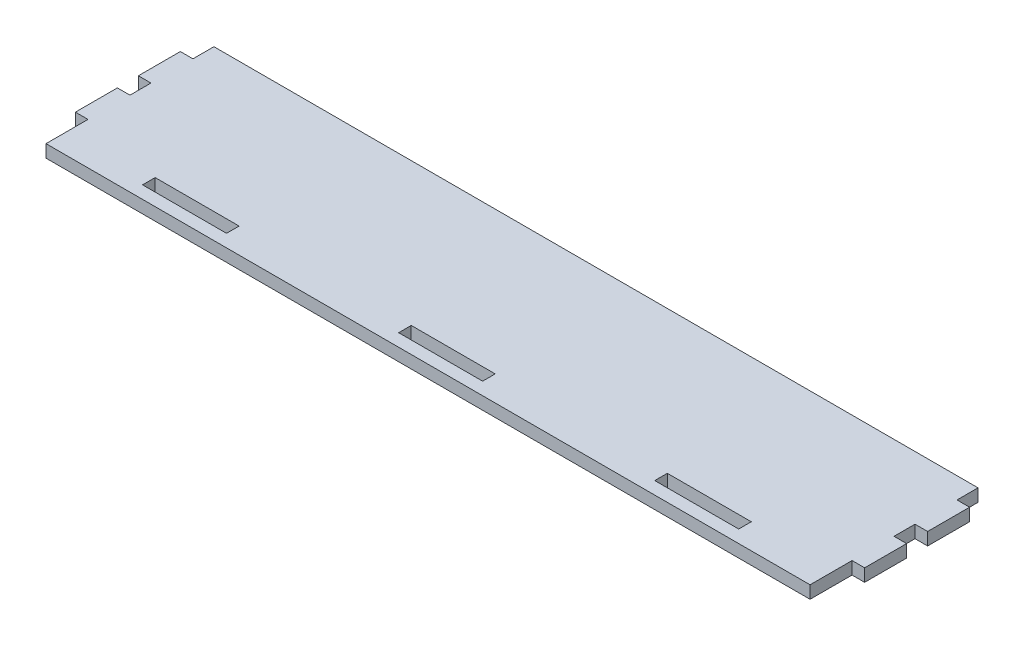
ISO-10303-21;
HEADER;
FILE_DESCRIPTION(('STEP AP214'),'2;1');
FILE_NAME('part.step','',(''),(''),'','','');
FILE_SCHEMA(('AUTOMOTIVE_DESIGN { 1 0 10303 214 1 1 1 1 }'));
ENDSEC;
DATA;
#1=APPLICATION_CONTEXT('core data for automotive mechanical design processes');
#2=APPLICATION_PROTOCOL_DEFINITION('international standard','automotive_design',2000,#1);
#3=PRODUCT_CONTEXT('',#1,'mechanical');
#4=PRODUCT('Part','Part','',(#3));
#5=PRODUCT_RELATED_PRODUCT_CATEGORY('part','',(#4));
#6=PRODUCT_DEFINITION_FORMATION('','',#4);
#7=PRODUCT_DEFINITION_CONTEXT('part definition',#1,'design');
#8=PRODUCT_DEFINITION('design','',#6,#7);
#9=PRODUCT_DEFINITION_SHAPE('','',#8);
#10=(LENGTH_UNIT() NAMED_UNIT(*) SI_UNIT(.MILLI.,.METRE.));
#11=(NAMED_UNIT(*) PLANE_ANGLE_UNIT() SI_UNIT($,.RADIAN.));
#12=(NAMED_UNIT(*) SI_UNIT($,.STERADIAN.) SOLID_ANGLE_UNIT());
#13=UNCERTAINTY_MEASURE_WITH_UNIT(LENGTH_MEASURE(1.E-05),#10,'distance_accuracy_value','');
#14=(GEOMETRIC_REPRESENTATION_CONTEXT(3) GLOBAL_UNCERTAINTY_ASSIGNED_CONTEXT((#13)) GLOBAL_UNIT_ASSIGNED_CONTEXT((#10,
#11,#12)) REPRESENTATION_CONTEXT('',''));
#15=CARTESIAN_POINT('',(0.,0.,0.));
#16=DIRECTION('',(0.,0.,1.));
#17=DIRECTION('',(1.,0.,0.));
#18=AXIS2_PLACEMENT_3D('',#15,#16,#17);
#19=CARTESIAN_POINT('',(0.,3.,0.));
#20=DIRECTION('',(0.,1.,0.));
#21=DIRECTION('',(0.,0.,1.));
#22=AXIS2_PLACEMENT_3D('',#19,#20,#21);
#23=PLANE('',#22);
#24=DIRECTION('',(0.,0.,1.));
#25=VECTOR('',#24,1.);
#26=CARTESIAN_POINT('',(0.,3.,0.));
#27=LINE('',#26,#25);
#28=CARTESIAN_POINT('',(0.,3.,-10.));
#29=VERTEX_POINT('',#28);
#30=CARTESIAN_POINT('',(0.,3.,0.));
#31=VERTEX_POINT('',#30);
#32=EDGE_CURVE('E340',#29,#31,#27,.T.);
#33=ORIENTED_EDGE('',*,*,#32,.T.);
#34=DIRECTION('',(1.,0.,0.));
#35=VECTOR('',#34,1.);
#36=CARTESIAN_POINT('',(0.,3.,0.));
#37=LINE('',#36,#35);
#38=CARTESIAN_POINT('',(182.,3.,0.));
#39=VERTEX_POINT('',#38);
#40=EDGE_CURVE('E343',#31,#39,#37,.T.);
#41=ORIENTED_EDGE('',*,*,#40,.T.);
#42=DIRECTION('',(0.,0.,-1.));
#43=VECTOR('',#42,1.);
#44=CARTESIAN_POINT('',(182.,3.,0.));
#45=LINE('',#44,#43);
#46=CARTESIAN_POINT('',(182.,3.,-9.99999999999999));
#47=VERTEX_POINT('',#46);
#48=EDGE_CURVE('E346',#39,#47,#45,.T.);
#49=ORIENTED_EDGE('',*,*,#48,.T.);
#50=DIRECTION('',(1.,0.,0.));
#51=VECTOR('',#50,1.);
#52=CARTESIAN_POINT('',(182.,3.,-9.99999999999999));
#53=LINE('',#52,#51);
#54=CARTESIAN_POINT('',(185.,3.,-9.99999999999999));
#55=VERTEX_POINT('',#54);
#56=EDGE_CURVE('E348',#47,#55,#53,.T.);
#57=ORIENTED_EDGE('',*,*,#56,.T.);
#58=DIRECTION('',(0.,0.,-1.));
#59=VECTOR('',#58,1.);
#60=CARTESIAN_POINT('',(185.,3.,-20.));
#61=LINE('',#60,#59);
#62=CARTESIAN_POINT('',(185.,3.,-20.));
#63=VERTEX_POINT('',#62);
#64=EDGE_CURVE('E350',#55,#63,#61,.T.);
#65=ORIENTED_EDGE('',*,*,#64,.T.);
#66=DIRECTION('',(-1.,0.,0.));
#67=VECTOR('',#66,1.);
#68=CARTESIAN_POINT('',(182.,3.,-20.));
#69=LINE('',#68,#67);
#70=CARTESIAN_POINT('',(182.,3.,-20.));
#71=VERTEX_POINT('',#70);
#72=EDGE_CURVE('E352',#63,#71,#69,.T.);
#73=ORIENTED_EDGE('',*,*,#72,.T.);
#74=DIRECTION('',(0.,0.,-1.));
#75=VECTOR('',#74,1.);
#76=CARTESIAN_POINT('',(182.,3.,-20.));
#77=LINE('',#76,#75);
#78=CARTESIAN_POINT('',(182.,3.,-25.));
#79=VERTEX_POINT('',#78);
#80=EDGE_CURVE('E354',#71,#79,#77,.T.);
#81=ORIENTED_EDGE('',*,*,#80,.T.);
#82=DIRECTION('',(1.,0.,0.));
#83=VECTOR('',#82,1.);
#84=CARTESIAN_POINT('',(182.,3.,-25.));
#85=LINE('',#84,#83);
#86=CARTESIAN_POINT('',(185.,3.,-25.));
#87=VERTEX_POINT('',#86);
#88=EDGE_CURVE('E356',#79,#87,#85,.T.);
#89=ORIENTED_EDGE('',*,*,#88,.T.);
#90=DIRECTION('',(0.,0.,-1.));
#91=VECTOR('',#90,1.);
#92=CARTESIAN_POINT('',(185.,3.,-35.));
#93=LINE('',#92,#91);
#94=CARTESIAN_POINT('',(185.,3.,-35.));
#95=VERTEX_POINT('',#94);
#96=EDGE_CURVE('E358',#87,#95,#93,.T.);
#97=ORIENTED_EDGE('',*,*,#96,.T.);
#98=DIRECTION('',(-1.,0.,0.));
#99=VECTOR('',#98,1.);
#100=CARTESIAN_POINT('',(182.,3.,-35.));
#101=LINE('',#100,#99);
#102=CARTESIAN_POINT('',(182.,3.,-35.));
#103=VERTEX_POINT('',#102);
#104=EDGE_CURVE('E360',#95,#103,#101,.T.);
#105=ORIENTED_EDGE('',*,*,#104,.T.);
#106=DIRECTION('',(0.,0.,-1.));
#107=VECTOR('',#106,1.);
#108=CARTESIAN_POINT('',(182.,3.,-35.));
#109=LINE('',#108,#107);
#110=CARTESIAN_POINT('',(182.,3.,-40.));
#111=VERTEX_POINT('',#110);
#112=EDGE_CURVE('E362',#103,#111,#109,.T.);
#113=ORIENTED_EDGE('',*,*,#112,.T.);
#114=DIRECTION('',(-1.,0.,0.));
#115=VECTOR('',#114,1.);
#116=CARTESIAN_POINT('',(0.,3.,-40.));
#117=LINE('',#116,#115);
#118=CARTESIAN_POINT('',(0.,3.,-40.));
#119=VERTEX_POINT('',#118);
#120=EDGE_CURVE('E364',#111,#119,#117,.T.);
#121=ORIENTED_EDGE('',*,*,#120,.T.);
#122=DIRECTION('',(0.,0.,1.));
#123=VECTOR('',#122,1.);
#124=CARTESIAN_POINT('',(0.,3.,-35.));
#125=LINE('',#124,#123);
#126=CARTESIAN_POINT('',(0.,3.,-35.));
#127=VERTEX_POINT('',#126);
#128=EDGE_CURVE('E366',#119,#127,#125,.T.);
#129=ORIENTED_EDGE('',*,*,#128,.T.);
#130=DIRECTION('',(-1.,0.,0.));
#131=VECTOR('',#130,1.);
#132=CARTESIAN_POINT('',(0.,3.,-35.));
#133=LINE('',#132,#131);
#134=CARTESIAN_POINT('',(-2.99999999999998,3.,-35.));
#135=VERTEX_POINT('',#134);
#136=EDGE_CURVE('E368',#127,#135,#133,.T.);
#137=ORIENTED_EDGE('',*,*,#136,.T.);
#138=DIRECTION('',(0.,0.,1.));
#139=VECTOR('',#138,1.);
#140=CARTESIAN_POINT('',(-2.99999999999998,3.,-35.));
#141=LINE('',#140,#139);
#142=CARTESIAN_POINT('',(-2.99999999999998,3.,-25.));
#143=VERTEX_POINT('',#142);
#144=EDGE_CURVE('E370',#135,#143,#141,.T.);
#145=ORIENTED_EDGE('',*,*,#144,.T.);
#146=DIRECTION('',(1.,0.,0.));
#147=VECTOR('',#146,1.);
#148=CARTESIAN_POINT('',(0.,3.,-25.));
#149=LINE('',#148,#147);
#150=CARTESIAN_POINT('',(0.,3.,-25.));
#151=VERTEX_POINT('',#150);
#152=EDGE_CURVE('E372',#143,#151,#149,.T.);
#153=ORIENTED_EDGE('',*,*,#152,.T.);
#154=DIRECTION('',(0.,0.,1.));
#155=VECTOR('',#154,1.);
#156=CARTESIAN_POINT('',(0.,3.,-20.));
#157=LINE('',#156,#155);
#158=CARTESIAN_POINT('',(0.,3.,-20.));
#159=VERTEX_POINT('',#158);
#160=EDGE_CURVE('E374',#151,#159,#157,.T.);
#161=ORIENTED_EDGE('',*,*,#160,.T.);
#162=DIRECTION('',(-1.,0.,0.));
#163=VECTOR('',#162,1.);
#164=CARTESIAN_POINT('',(0.,3.,-20.));
#165=LINE('',#164,#163);
#166=CARTESIAN_POINT('',(-3.,3.,-20.));
#167=VERTEX_POINT('',#166);
#168=EDGE_CURVE('E376',#159,#167,#165,.T.);
#169=ORIENTED_EDGE('',*,*,#168,.T.);
#170=DIRECTION('',(0.,0.,1.));
#171=VECTOR('',#170,1.);
#172=CARTESIAN_POINT('',(-3.,3.,-20.));
#173=LINE('',#172,#171);
#174=CARTESIAN_POINT('',(-3.,3.,-10.));
#175=VERTEX_POINT('',#174);
#176=EDGE_CURVE('E378',#167,#175,#173,.T.);
#177=ORIENTED_EDGE('',*,*,#176,.T.);
#178=DIRECTION('',(1.,0.,0.));
#179=VECTOR('',#178,1.);
#180=CARTESIAN_POINT('',(0.,3.,-10.));
#181=LINE('',#180,#179);
#182=EDGE_CURVE('E380',#175,#29,#181,.T.);
#183=ORIENTED_EDGE('',*,*,#182,.T.);
#184=EDGE_LOOP('',(#33,#41,#49,#57,#65,#73,#81,#89,#97,#105,#113,#121,#129,#137,#145,#153,#161,
#169,#177,#183));
#185=FACE_BOUND('',#184,.T.);
#186=DIRECTION('',(1.,0.,0.));
#187=VECTOR('',#186,1.);
#188=CARTESIAN_POINT('',(20.,3.,-3.));
#189=LINE('',#188,#187);
#190=CARTESIAN_POINT('',(20.,3.,-3.));
#191=VERTEX_POINT('',#190);
#192=CARTESIAN_POINT('',(40.,3.,-3.00000000000001));
#193=VERTEX_POINT('',#192);
#194=EDGE_CURVE('E311',#191,#193,#189,.T.);
#195=ORIENTED_EDGE('',*,*,#194,.F.);
#196=DIRECTION('',(0.,0.,1.));
#197=VECTOR('',#196,1.);
#198=CARTESIAN_POINT('',(20.,3.,-6.));
#199=LINE('',#198,#197);
#200=CARTESIAN_POINT('',(20.,3.,-6.));
#201=VERTEX_POINT('',#200);
#202=EDGE_CURVE('E309',#201,#191,#199,.T.);
#203=ORIENTED_EDGE('',*,*,#202,.F.);
#204=DIRECTION('',(-1.,0.,0.));
#205=VECTOR('',#204,1.);
#206=CARTESIAN_POINT('',(20.,3.,-6.));
#207=LINE('',#206,#205);
#208=CARTESIAN_POINT('',(40.,3.,-6.00000000000001));
#209=VERTEX_POINT('',#208);
#210=EDGE_CURVE('E317',#209,#201,#207,.T.);
#211=ORIENTED_EDGE('',*,*,#210,.F.);
#212=DIRECTION('',(0.,0.,-1.));
#213=VECTOR('',#212,1.);
#214=CARTESIAN_POINT('',(40.,3.,-6.00000000000001));
#215=LINE('',#214,#213);
#216=EDGE_CURVE('E314',#193,#209,#215,.T.);
#217=ORIENTED_EDGE('',*,*,#216,.F.);
#218=EDGE_LOOP('',(#195,#203,#211,#217));
#219=FACE_BOUND('',#218,.T.);
#220=DIRECTION('',(1.,0.,0.));
#221=VECTOR('',#220,1.);
#222=CARTESIAN_POINT('',(142.,3.,-3.));
#223=LINE('',#222,#221);
#224=CARTESIAN_POINT('',(142.,3.,-3.));
#225=VERTEX_POINT('',#224);
#226=CARTESIAN_POINT('',(162.,3.,-3.));
#227=VERTEX_POINT('',#226);
#228=EDGE_CURVE('E280',#225,#227,#223,.T.);
#229=ORIENTED_EDGE('',*,*,#228,.F.);
#230=DIRECTION('',(0.,0.,1.));
#231=VECTOR('',#230,1.);
#232=CARTESIAN_POINT('',(142.,3.,-6.));
#233=LINE('',#232,#231);
#234=CARTESIAN_POINT('',(142.,3.,-6.));
#235=VERTEX_POINT('',#234);
#236=EDGE_CURVE('E278',#235,#225,#233,.T.);
#237=ORIENTED_EDGE('',*,*,#236,.F.);
#238=DIRECTION('',(-1.,0.,0.));
#239=VECTOR('',#238,1.);
#240=CARTESIAN_POINT('',(142.,3.,-6.));
#241=LINE('',#240,#239);
#242=CARTESIAN_POINT('',(162.,3.,-6.));
#243=VERTEX_POINT('',#242);
#244=EDGE_CURVE('E286',#243,#235,#241,.T.);
#245=ORIENTED_EDGE('',*,*,#244,.F.);
#246=DIRECTION('',(0.,0.,-1.));
#247=VECTOR('',#246,1.);
#248=CARTESIAN_POINT('',(162.,3.,-6.));
#249=LINE('',#248,#247);
#250=EDGE_CURVE('E283',#227,#243,#249,.T.);
#251=ORIENTED_EDGE('',*,*,#250,.F.);
#252=EDGE_LOOP('',(#229,#237,#245,#251));
#253=FACE_BOUND('',#252,.T.);
#254=DIRECTION('',(1.,0.,0.));
#255=VECTOR('',#254,1.);
#256=CARTESIAN_POINT('',(81.,3.,-3.));
#257=LINE('',#256,#255);
#258=CARTESIAN_POINT('',(81.,3.,-3.));
#259=VERTEX_POINT('',#258);
#260=CARTESIAN_POINT('',(101.,3.,-3.));
#261=VERTEX_POINT('',#260);
#262=EDGE_CURVE('E250',#259,#261,#257,.T.);
#263=ORIENTED_EDGE('',*,*,#262,.F.);
#264=DIRECTION('',(0.,0.,1.));
#265=VECTOR('',#264,1.);
#266=CARTESIAN_POINT('',(81.,3.,-6.));
#267=LINE('',#266,#265);
#268=CARTESIAN_POINT('',(81.,3.,-6.));
#269=VERTEX_POINT('',#268);
#270=EDGE_CURVE('E242',#269,#259,#267,.T.);
#271=ORIENTED_EDGE('',*,*,#270,.F.);
#272=DIRECTION('',(-1.,0.,0.));
#273=VECTOR('',#272,1.);
#274=CARTESIAN_POINT('',(81.,3.,-6.));
#275=LINE('',#274,#273);
#276=CARTESIAN_POINT('',(101.,3.,-6.));
#277=VERTEX_POINT('',#276);
#278=EDGE_CURVE('E264',#277,#269,#275,.T.);
#279=ORIENTED_EDGE('',*,*,#278,.F.);
#280=DIRECTION('',(0.,0.,-1.));
#281=VECTOR('',#280,1.);
#282=CARTESIAN_POINT('',(101.,3.,-6.));
#283=LINE('',#282,#281);
#284=EDGE_CURVE('E262',#261,#277,#283,.T.);
#285=ORIENTED_EDGE('',*,*,#284,.F.);
#286=EDGE_LOOP('',(#263,#271,#279,#285));
#287=FACE_BOUND('',#286,.T.);
#288=ADVANCED_FACE('F33',(#185,#219,#253,#287),#23,.T.);
#289=CARTESIAN_POINT('',(0.,0.,0.));
#290=DIRECTION('',(0.,1.,0.));
#291=DIRECTION('',(0.,0.,1.));
#292=AXIS2_PLACEMENT_3D('',#289,#290,#291);
#293=PLANE('',#292);
#294=DIRECTION('',(0.,0.,1.));
#295=VECTOR('',#294,1.);
#296=CARTESIAN_POINT('',(142.,0.,-6.));
#297=LINE('',#296,#295);
#298=CARTESIAN_POINT('',(142.,0.,-6.));
#299=VERTEX_POINT('',#298);
#300=CARTESIAN_POINT('',(142.,0.,-3.));
#301=VERTEX_POINT('',#300);
#302=EDGE_CURVE('E258',#299,#301,#297,.T.);
#303=ORIENTED_EDGE('',*,*,#302,.T.);
#304=DIRECTION('',(1.,0.,0.));
#305=VECTOR('',#304,1.);
#306=CARTESIAN_POINT('',(142.,0.,-3.));
#307=LINE('',#306,#305);
#308=CARTESIAN_POINT('',(162.,0.,-3.));
#309=VERTEX_POINT('',#308);
#310=EDGE_CURVE('E291',#301,#309,#307,.T.);
#311=ORIENTED_EDGE('',*,*,#310,.T.);
#312=DIRECTION('',(0.,0.,-1.));
#313=VECTOR('',#312,1.);
#314=CARTESIAN_POINT('',(162.,0.,-6.));
#315=LINE('',#314,#313);
#316=CARTESIAN_POINT('',(162.,0.,-6.));
#317=VERTEX_POINT('',#316);
#318=EDGE_CURVE('E294',#309,#317,#315,.T.);
#319=ORIENTED_EDGE('',*,*,#318,.T.);
#320=DIRECTION('',(-1.,0.,0.));
#321=VECTOR('',#320,1.);
#322=CARTESIAN_POINT('',(142.,0.,-6.));
#323=LINE('',#322,#321);
#324=EDGE_CURVE('E281',#317,#299,#323,.T.);
#325=ORIENTED_EDGE('',*,*,#324,.T.);
#326=EDGE_LOOP('',(#303,#311,#319,#325));
#327=FACE_BOUND('',#326,.T.);
#328=DIRECTION('',(0.,0.,1.));
#329=VECTOR('',#328,1.);
#330=CARTESIAN_POINT('',(0.,0.,0.));
#331=LINE('',#330,#329);
#332=CARTESIAN_POINT('',(0.,0.,-10.));
#333=VERTEX_POINT('',#332);
#334=CARTESIAN_POINT('',(0.,0.,0.));
#335=VERTEX_POINT('',#334);
#336=EDGE_CURVE('E339',#333,#335,#331,.T.);
#337=ORIENTED_EDGE('',*,*,#336,.F.);
#338=DIRECTION('',(1.,0.,0.));
#339=VECTOR('',#338,1.);
#340=CARTESIAN_POINT('',(0.,0.,-10.));
#341=LINE('',#340,#339);
#342=CARTESIAN_POINT('',(-3.,0.,-10.));
#343=VERTEX_POINT('',#342);
#344=EDGE_CURVE('E344',#343,#333,#341,.T.);
#345=ORIENTED_EDGE('',*,*,#344,.F.);
#346=DIRECTION('',(0.,0.,1.));
#347=VECTOR('',#346,1.);
#348=CARTESIAN_POINT('',(-3.,0.,-20.));
#349=LINE('',#348,#347);
#350=CARTESIAN_POINT('',(-3.,0.,-20.));
#351=VERTEX_POINT('',#350);
#352=EDGE_CURVE('E419',#351,#343,#349,.T.);
#353=ORIENTED_EDGE('',*,*,#352,.F.);
#354=DIRECTION('',(-1.,0.,0.));
#355=VECTOR('',#354,1.);
#356=CARTESIAN_POINT('',(0.,0.,-20.));
#357=LINE('',#356,#355);
#358=CARTESIAN_POINT('',(0.,0.,-20.));
#359=VERTEX_POINT('',#358);
#360=EDGE_CURVE('E417',#359,#351,#357,.T.);
#361=ORIENTED_EDGE('',*,*,#360,.F.);
#362=DIRECTION('',(0.,0.,1.));
#363=VECTOR('',#362,1.);
#364=CARTESIAN_POINT('',(0.,0.,-20.));
#365=LINE('',#364,#363);
#366=CARTESIAN_POINT('',(0.,0.,-25.));
#367=VERTEX_POINT('',#366);
#368=EDGE_CURVE('E415',#367,#359,#365,.T.);
#369=ORIENTED_EDGE('',*,*,#368,.F.);
#370=DIRECTION('',(1.,0.,0.));
#371=VECTOR('',#370,1.);
#372=CARTESIAN_POINT('',(0.,0.,-25.));
#373=LINE('',#372,#371);
#374=CARTESIAN_POINT('',(-2.99999999999998,0.,-25.));
#375=VERTEX_POINT('',#374);
#376=EDGE_CURVE('E413',#375,#367,#373,.T.);
#377=ORIENTED_EDGE('',*,*,#376,.F.);
#378=DIRECTION('',(0.,0.,1.));
#379=VECTOR('',#378,1.);
#380=CARTESIAN_POINT('',(-2.99999999999998,0.,-35.));
#381=LINE('',#380,#379);
#382=CARTESIAN_POINT('',(-2.99999999999998,0.,-35.));
#383=VERTEX_POINT('',#382);
#384=EDGE_CURVE('E411',#383,#375,#381,.T.);
#385=ORIENTED_EDGE('',*,*,#384,.F.);
#386=DIRECTION('',(-1.,0.,0.));
#387=VECTOR('',#386,1.);
#388=CARTESIAN_POINT('',(0.,0.,-35.));
#389=LINE('',#388,#387);
#390=CARTESIAN_POINT('',(0.,0.,-35.));
#391=VERTEX_POINT('',#390);
#392=EDGE_CURVE('E409',#391,#383,#389,.T.);
#393=ORIENTED_EDGE('',*,*,#392,.F.);
#394=DIRECTION('',(0.,0.,1.));
#395=VECTOR('',#394,1.);
#396=CARTESIAN_POINT('',(0.,0.,-35.));
#397=LINE('',#396,#395);
#398=CARTESIAN_POINT('',(0.,0.,-40.));
#399=VERTEX_POINT('',#398);
#400=EDGE_CURVE('E407',#399,#391,#397,.T.);
#401=ORIENTED_EDGE('',*,*,#400,.F.);
#402=DIRECTION('',(-1.,0.,0.));
#403=VECTOR('',#402,1.);
#404=CARTESIAN_POINT('',(0.,0.,-40.));
#405=LINE('',#404,#403);
#406=CARTESIAN_POINT('',(182.,0.,-40.));
#407=VERTEX_POINT('',#406);
#408=EDGE_CURVE('E405',#407,#399,#405,.T.);
#409=ORIENTED_EDGE('',*,*,#408,.F.);
#410=DIRECTION('',(0.,0.,-1.));
#411=VECTOR('',#410,1.);
#412=CARTESIAN_POINT('',(182.,0.,-35.));
#413=LINE('',#412,#411);
#414=CARTESIAN_POINT('',(182.,0.,-35.));
#415=VERTEX_POINT('',#414);
#416=EDGE_CURVE('E403',#415,#407,#413,.T.);
#417=ORIENTED_EDGE('',*,*,#416,.F.);
#418=DIRECTION('',(-1.,0.,0.));
#419=VECTOR('',#418,1.);
#420=CARTESIAN_POINT('',(182.,0.,-35.));
#421=LINE('',#420,#419);
#422=CARTESIAN_POINT('',(185.,0.,-35.));
#423=VERTEX_POINT('',#422);
#424=EDGE_CURVE('E401',#423,#415,#421,.T.);
#425=ORIENTED_EDGE('',*,*,#424,.F.);
#426=DIRECTION('',(0.,0.,-1.));
#427=VECTOR('',#426,1.);
#428=CARTESIAN_POINT('',(185.,0.,-35.));
#429=LINE('',#428,#427);
#430=CARTESIAN_POINT('',(185.,0.,-25.));
#431=VERTEX_POINT('',#430);
#432=EDGE_CURVE('E399',#431,#423,#429,.T.);
#433=ORIENTED_EDGE('',*,*,#432,.F.);
#434=DIRECTION('',(1.,0.,0.));
#435=VECTOR('',#434,1.);
#436=CARTESIAN_POINT('',(182.,0.,-25.));
#437=LINE('',#436,#435);
#438=CARTESIAN_POINT('',(182.,0.,-25.));
#439=VERTEX_POINT('',#438);
#440=EDGE_CURVE('E397',#439,#431,#437,.T.);
#441=ORIENTED_EDGE('',*,*,#440,.F.);
#442=DIRECTION('',(0.,0.,-1.));
#443=VECTOR('',#442,1.);
#444=CARTESIAN_POINT('',(182.,0.,-20.));
#445=LINE('',#444,#443);
#446=CARTESIAN_POINT('',(182.,0.,-20.));
#447=VERTEX_POINT('',#446);
#448=EDGE_CURVE('E395',#447,#439,#445,.T.);
#449=ORIENTED_EDGE('',*,*,#448,.F.);
#450=DIRECTION('',(-1.,0.,0.));
#451=VECTOR('',#450,1.);
#452=CARTESIAN_POINT('',(182.,0.,-20.));
#453=LINE('',#452,#451);
#454=CARTESIAN_POINT('',(185.,0.,-20.));
#455=VERTEX_POINT('',#454);
#456=EDGE_CURVE('E393',#455,#447,#453,.T.);
#457=ORIENTED_EDGE('',*,*,#456,.F.);
#458=DIRECTION('',(0.,0.,-1.));
#459=VECTOR('',#458,1.);
#460=CARTESIAN_POINT('',(185.,0.,-20.));
#461=LINE('',#460,#459);
#462=CARTESIAN_POINT('',(185.,0.,-9.99999999999999));
#463=VERTEX_POINT('',#462);
#464=EDGE_CURVE('E391',#463,#455,#461,.T.);
#465=ORIENTED_EDGE('',*,*,#464,.F.);
#466=DIRECTION('',(1.,0.,0.));
#467=VECTOR('',#466,1.);
#468=CARTESIAN_POINT('',(182.,0.,-9.99999999999999));
#469=LINE('',#468,#467);
#470=CARTESIAN_POINT('',(182.,0.,-9.99999999999999));
#471=VERTEX_POINT('',#470);
#472=EDGE_CURVE('E389',#471,#463,#469,.T.);
#473=ORIENTED_EDGE('',*,*,#472,.F.);
#474=DIRECTION('',(0.,0.,-1.));
#475=VECTOR('',#474,1.);
#476=CARTESIAN_POINT('',(182.,0.,0.));
#477=LINE('',#476,#475);
#478=CARTESIAN_POINT('',(182.,0.,0.));
#479=VERTEX_POINT('',#478);
#480=EDGE_CURVE('E387',#479,#471,#477,.T.);
#481=ORIENTED_EDGE('',*,*,#480,.F.);
#482=DIRECTION('',(1.,0.,0.));
#483=VECTOR('',#482,1.);
#484=CARTESIAN_POINT('',(0.,0.,0.));
#485=LINE('',#484,#483);
#486=EDGE_CURVE('E385',#335,#479,#485,.T.);
#487=ORIENTED_EDGE('',*,*,#486,.F.);
#488=EDGE_LOOP('',(#337,#345,#353,#361,#369,#377,#385,#393,#401,#409,#417,#425,#433,#441,#449,
#457,#465,#473,#481,#487));
#489=FACE_BOUND('',#488,.T.);
#490=DIRECTION('',(0.,0.,1.));
#491=VECTOR('',#490,1.);
#492=CARTESIAN_POINT('',(20.,0.,-6.));
#493=LINE('',#492,#491);
#494=CARTESIAN_POINT('',(20.,0.,-6.));
#495=VERTEX_POINT('',#494);
#496=CARTESIAN_POINT('',(20.,0.,-3.));
#497=VERTEX_POINT('',#496);
#498=EDGE_CURVE('E308',#495,#497,#493,.T.);
#499=ORIENTED_EDGE('',*,*,#498,.T.);
#500=DIRECTION('',(1.,0.,0.));
#501=VECTOR('',#500,1.);
#502=CARTESIAN_POINT('',(20.,0.,-3.));
#503=LINE('',#502,#501);
#504=CARTESIAN_POINT('',(40.,0.,-3.00000000000001));
#505=VERTEX_POINT('',#504);
#506=EDGE_CURVE('E322',#497,#505,#503,.T.);
#507=ORIENTED_EDGE('',*,*,#506,.T.);
#508=DIRECTION('',(0.,0.,-1.));
#509=VECTOR('',#508,1.);
#510=CARTESIAN_POINT('',(40.,0.,-6.00000000000001));
#511=LINE('',#510,#509);
#512=CARTESIAN_POINT('',(40.,0.,-6.00000000000001));
#513=VERTEX_POINT('',#512);
#514=EDGE_CURVE('E325',#505,#513,#511,.T.);
#515=ORIENTED_EDGE('',*,*,#514,.T.);
#516=DIRECTION('',(-1.,0.,0.));
#517=VECTOR('',#516,1.);
#518=CARTESIAN_POINT('',(20.,0.,-6.));
#519=LINE('',#518,#517);
#520=EDGE_CURVE('E312',#513,#495,#519,.T.);
#521=ORIENTED_EDGE('',*,*,#520,.T.);
#522=EDGE_LOOP('',(#499,#507,#515,#521));
#523=FACE_BOUND('',#522,.T.);
#524=DIRECTION('',(0.,0.,1.));
#525=VECTOR('',#524,1.);
#526=CARTESIAN_POINT('',(81.,0.,-6.));
#527=LINE('',#526,#525);
#528=CARTESIAN_POINT('',(81.,0.,-6.));
#529=VERTEX_POINT('',#528);
#530=CARTESIAN_POINT('',(81.,0.,-3.));
#531=VERTEX_POINT('',#530);
#532=EDGE_CURVE('E56',#529,#531,#527,.T.);
#533=ORIENTED_EDGE('',*,*,#532,.T.);
#534=DIRECTION('',(1.,0.,0.));
#535=VECTOR('',#534,1.);
#536=CARTESIAN_POINT('',(81.,0.,-3.));
#537=LINE('',#536,#535);
#538=CARTESIAN_POINT('',(101.,0.,-3.));
#539=VERTEX_POINT('',#538);
#540=EDGE_CURVE('E257',#531,#539,#537,.T.);
#541=ORIENTED_EDGE('',*,*,#540,.T.);
#542=DIRECTION('',(0.,0.,-1.));
#543=VECTOR('',#542,1.);
#544=CARTESIAN_POINT('',(101.,0.,-6.));
#545=LINE('',#544,#543);
#546=CARTESIAN_POINT('',(101.,0.,-6.));
#547=VERTEX_POINT('',#546);
#548=EDGE_CURVE('E270',#539,#547,#545,.T.);
#549=ORIENTED_EDGE('',*,*,#548,.T.);
#550=DIRECTION('',(-1.,0.,0.));
#551=VECTOR('',#550,1.);
#552=CARTESIAN_POINT('',(81.,0.,-6.));
#553=LINE('',#552,#551);
#554=EDGE_CURVE('E251',#547,#529,#553,.T.);
#555=ORIENTED_EDGE('',*,*,#554,.T.);
#556=EDGE_LOOP('',(#533,#541,#549,#555));
#557=FACE_BOUND('',#556,.T.);
#558=ADVANCED_FACE('F485',(#327,#489,#523,#557),#293,.F.);
#559=CARTESIAN_POINT('',(0.,3.,0.));
#560=DIRECTION('',(1.,0.,0.));
#561=DIRECTION('',(0.,0.,-1.));
#562=AXIS2_PLACEMENT_3D('',#559,#560,#561);
#563=PLANE('',#562);
#564=ORIENTED_EDGE('',*,*,#336,.T.);
#565=DIRECTION('',(0.,-1.,0.));
#566=VECTOR('',#565,1.);
#567=CARTESIAN_POINT('',(0.,3.,0.));
#568=LINE('',#567,#566);
#569=EDGE_CURVE('E11',#31,#335,#568,.T.);
#570=ORIENTED_EDGE('',*,*,#569,.F.);
#571=ORIENTED_EDGE('',*,*,#32,.F.);
#572=DIRECTION('',(0.,-1.,0.));
#573=VECTOR('',#572,1.);
#574=CARTESIAN_POINT('',(0.,3.,-10.));
#575=LINE('',#574,#573);
#576=EDGE_CURVE('E382',#29,#333,#575,.T.);
#577=ORIENTED_EDGE('',*,*,#576,.T.);
#578=EDGE_LOOP('',(#564,#570,#571,#577));
#579=FACE_BOUND('',#578,.T.);
#580=ADVANCED_FACE('F35',(#579),#563,.F.);
#581=CARTESIAN_POINT('',(0.,3.,0.));
#582=DIRECTION('',(0.,0.,-1.));
#583=DIRECTION('',(-1.,0.,0.));
#584=AXIS2_PLACEMENT_3D('',#581,#582,#583);
#585=PLANE('',#584);
#586=ORIENTED_EDGE('',*,*,#486,.T.);
#587=DIRECTION('',(0.,-1.,0.));
#588=VECTOR('',#587,1.);
#589=CARTESIAN_POINT('',(182.,3.,0.));
#590=LINE('',#589,#588);
#591=EDGE_CURVE('E41',#39,#479,#590,.T.);
#592=ORIENTED_EDGE('',*,*,#591,.F.);
#593=ORIENTED_EDGE('',*,*,#40,.F.);
#594=ORIENTED_EDGE('',*,*,#569,.T.);
#595=EDGE_LOOP('',(#586,#592,#593,#594));
#596=FACE_BOUND('',#595,.T.);
#597=ADVANCED_FACE('F503',(#596),#585,.F.);
#598=CARTESIAN_POINT('',(182.,3.,0.));
#599=DIRECTION('',(-1.,0.,0.));
#600=DIRECTION('',(0.,0.,1.));
#601=AXIS2_PLACEMENT_3D('',#598,#599,#600);
#602=PLANE('',#601);
#603=ORIENTED_EDGE('',*,*,#480,.T.);
#604=DIRECTION('',(0.,-1.,0.));
#605=VECTOR('',#604,1.);
#606=CARTESIAN_POINT('',(182.,3.,-9.99999999999999));
#607=LINE('',#606,#605);
#608=EDGE_CURVE('E472',#47,#471,#607,.T.);
#609=ORIENTED_EDGE('',*,*,#608,.F.);
#610=ORIENTED_EDGE('',*,*,#48,.F.);
#611=ORIENTED_EDGE('',*,*,#591,.T.);
#612=EDGE_LOOP('',(#603,#609,#610,#611));
#613=FACE_BOUND('',#612,.T.);
#614=ADVANCED_FACE('F479',(#613),#602,.F.);
#615=CARTESIAN_POINT('',(182.,3.,-9.99999999999999));
#616=DIRECTION('',(0.,0.,-1.));
#617=DIRECTION('',(-1.,0.,0.));
#618=AXIS2_PLACEMENT_3D('',#615,#616,#617);
#619=PLANE('',#618);
#620=ORIENTED_EDGE('',*,*,#472,.T.);
#621=DIRECTION('',(0.,-1.,0.));
#622=VECTOR('',#621,1.);
#623=CARTESIAN_POINT('',(185.,3.,-9.99999999999999));
#624=LINE('',#623,#622);
#625=EDGE_CURVE('E469',#55,#463,#624,.T.);
#626=ORIENTED_EDGE('',*,*,#625,.F.);
#627=ORIENTED_EDGE('',*,*,#56,.F.);
#628=ORIENTED_EDGE('',*,*,#608,.T.);
#629=EDGE_LOOP('',(#620,#626,#627,#628));
#630=FACE_BOUND('',#629,.T.);
#631=ADVANCED_FACE('F491',(#630),#619,.F.);
#632=CARTESIAN_POINT('',(185.,3.,-20.));
#633=DIRECTION('',(-1.,0.,0.));
#634=DIRECTION('',(0.,0.,1.));
#635=AXIS2_PLACEMENT_3D('',#632,#633,#634);
#636=PLANE('',#635);
#637=ORIENTED_EDGE('',*,*,#464,.T.);
#638=DIRECTION('',(0.,-1.,0.));
#639=VECTOR('',#638,1.);
#640=CARTESIAN_POINT('',(185.,3.,-20.));
#641=LINE('',#640,#639);
#642=EDGE_CURVE('E466',#63,#455,#641,.T.);
#643=ORIENTED_EDGE('',*,*,#642,.F.);
#644=ORIENTED_EDGE('',*,*,#64,.F.);
#645=ORIENTED_EDGE('',*,*,#625,.T.);
#646=EDGE_LOOP('',(#637,#643,#644,#645));
#647=FACE_BOUND('',#646,.T.);
#648=ADVANCED_FACE('F495',(#647),#636,.F.);
#649=CARTESIAN_POINT('',(182.,3.,-20.));
#650=DIRECTION('',(0.,0.,1.));
#651=DIRECTION('',(1.,0.,0.));
#652=AXIS2_PLACEMENT_3D('',#649,#650,#651);
#653=PLANE('',#652);
#654=ORIENTED_EDGE('',*,*,#456,.T.);
#655=DIRECTION('',(0.,-1.,0.));
#656=VECTOR('',#655,1.);
#657=CARTESIAN_POINT('',(182.,3.,-20.));
#658=LINE('',#657,#656);
#659=EDGE_CURVE('E463',#71,#447,#658,.T.);
#660=ORIENTED_EDGE('',*,*,#659,.F.);
#661=ORIENTED_EDGE('',*,*,#72,.F.);
#662=ORIENTED_EDGE('',*,*,#642,.T.);
#663=EDGE_LOOP('',(#654,#660,#661,#662));
#664=FACE_BOUND('',#663,.T.);
#665=ADVANCED_FACE('F576',(#664),#653,.F.);
#666=CARTESIAN_POINT('',(182.,3.,-20.));
#667=DIRECTION('',(-1.,0.,0.));
#668=DIRECTION('',(0.,0.,1.));
#669=AXIS2_PLACEMENT_3D('',#666,#667,#668);
#670=PLANE('',#669);
#671=ORIENTED_EDGE('',*,*,#448,.T.);
#672=DIRECTION('',(0.,-1.,0.));
#673=VECTOR('',#672,1.);
#674=CARTESIAN_POINT('',(182.,3.,-25.));
#675=LINE('',#674,#673);
#676=EDGE_CURVE('E460',#79,#439,#675,.T.);
#677=ORIENTED_EDGE('',*,*,#676,.F.);
#678=ORIENTED_EDGE('',*,*,#80,.F.);
#679=ORIENTED_EDGE('',*,*,#659,.T.);
#680=EDGE_LOOP('',(#671,#677,#678,#679));
#681=FACE_BOUND('',#680,.T.);
#682=ADVANCED_FACE('F574',(#681),#670,.F.);
#683=CARTESIAN_POINT('',(182.,3.,-25.));
#684=DIRECTION('',(0.,0.,-1.));
#685=DIRECTION('',(-1.,0.,0.));
#686=AXIS2_PLACEMENT_3D('',#683,#684,#685);
#687=PLANE('',#686);
#688=ORIENTED_EDGE('',*,*,#440,.T.);
#689=DIRECTION('',(0.,-1.,0.));
#690=VECTOR('',#689,1.);
#691=CARTESIAN_POINT('',(185.,3.,-25.));
#692=LINE('',#691,#690);
#693=EDGE_CURVE('E457',#87,#431,#692,.T.);
#694=ORIENTED_EDGE('',*,*,#693,.F.);
#695=ORIENTED_EDGE('',*,*,#88,.F.);
#696=ORIENTED_EDGE('',*,*,#676,.T.);
#697=EDGE_LOOP('',(#688,#694,#695,#696));
#698=FACE_BOUND('',#697,.T.);
#699=ADVANCED_FACE('F569',(#698),#687,.F.);
#700=CARTESIAN_POINT('',(185.,3.,-35.));
#701=DIRECTION('',(-1.,0.,0.));
#702=DIRECTION('',(0.,0.,1.));
#703=AXIS2_PLACEMENT_3D('',#700,#701,#702);
#704=PLANE('',#703);
#705=ORIENTED_EDGE('',*,*,#432,.T.);
#706=DIRECTION('',(0.,-1.,0.));
#707=VECTOR('',#706,1.);
#708=CARTESIAN_POINT('',(185.,3.,-35.));
#709=LINE('',#708,#707);
#710=EDGE_CURVE('E454',#95,#423,#709,.T.);
#711=ORIENTED_EDGE('',*,*,#710,.F.);
#712=ORIENTED_EDGE('',*,*,#96,.F.);
#713=ORIENTED_EDGE('',*,*,#693,.T.);
#714=EDGE_LOOP('',(#705,#711,#712,#713));
#715=FACE_BOUND('',#714,.T.);
#716=ADVANCED_FACE('F564',(#715),#704,.F.);
#717=CARTESIAN_POINT('',(182.,3.,-35.));
#718=DIRECTION('',(0.,0.,1.));
#719=DIRECTION('',(1.,0.,0.));
#720=AXIS2_PLACEMENT_3D('',#717,#718,#719);
#721=PLANE('',#720);
#722=ORIENTED_EDGE('',*,*,#424,.T.);
#723=DIRECTION('',(0.,-1.,0.));
#724=VECTOR('',#723,1.);
#725=CARTESIAN_POINT('',(182.,3.,-35.));
#726=LINE('',#725,#724);
#727=EDGE_CURVE('E451',#103,#415,#726,.T.);
#728=ORIENTED_EDGE('',*,*,#727,.F.);
#729=ORIENTED_EDGE('',*,*,#104,.F.);
#730=ORIENTED_EDGE('',*,*,#710,.T.);
#731=EDGE_LOOP('',(#722,#728,#729,#730));
#732=FACE_BOUND('',#731,.T.);
#733=ADVANCED_FACE('F560',(#732),#721,.F.);
#734=CARTESIAN_POINT('',(182.,3.,-35.));
#735=DIRECTION('',(-1.,0.,0.));
#736=DIRECTION('',(0.,0.,1.));
#737=AXIS2_PLACEMENT_3D('',#734,#735,#736);
#738=PLANE('',#737);
#739=ORIENTED_EDGE('',*,*,#416,.T.);
#740=DIRECTION('',(0.,-1.,0.));
#741=VECTOR('',#740,1.);
#742=CARTESIAN_POINT('',(182.,3.,-40.));
#743=LINE('',#742,#741);
#744=EDGE_CURVE('E448',#111,#407,#743,.T.);
#745=ORIENTED_EDGE('',*,*,#744,.F.);
#746=ORIENTED_EDGE('',*,*,#112,.F.);
#747=ORIENTED_EDGE('',*,*,#727,.T.);
#748=EDGE_LOOP('',(#739,#745,#746,#747));
#749=FACE_BOUND('',#748,.T.);
#750=ADVANCED_FACE('F555',(#749),#738,.F.);
#751=CARTESIAN_POINT('',(0.,3.,-40.));
#752=DIRECTION('',(0.,0.,1.));
#753=DIRECTION('',(1.,0.,0.));
#754=AXIS2_PLACEMENT_3D('',#751,#752,#753);
#755=PLANE('',#754);
#756=ORIENTED_EDGE('',*,*,#408,.T.);
#757=DIRECTION('',(0.,-1.,0.));
#758=VECTOR('',#757,1.);
#759=CARTESIAN_POINT('',(0.,3.,-40.));
#760=LINE('',#759,#758);
#761=EDGE_CURVE('E445',#119,#399,#760,.T.);
#762=ORIENTED_EDGE('',*,*,#761,.F.);
#763=ORIENTED_EDGE('',*,*,#120,.F.);
#764=ORIENTED_EDGE('',*,*,#744,.T.);
#765=EDGE_LOOP('',(#756,#762,#763,#764));
#766=FACE_BOUND('',#765,.T.);
#767=ADVANCED_FACE('F549',(#766),#755,.F.);
#768=CARTESIAN_POINT('',(0.,3.,-35.));
#769=DIRECTION('',(1.,0.,0.));
#770=DIRECTION('',(0.,0.,-1.));
#771=AXIS2_PLACEMENT_3D('',#768,#769,#770);
#772=PLANE('',#771);
#773=ORIENTED_EDGE('',*,*,#400,.T.);
#774=DIRECTION('',(0.,-1.,0.));
#775=VECTOR('',#774,1.);
#776=CARTESIAN_POINT('',(0.,3.,-35.));
#777=LINE('',#776,#775);
#778=EDGE_CURVE('E442',#127,#391,#777,.T.);
#779=ORIENTED_EDGE('',*,*,#778,.F.);
#780=ORIENTED_EDGE('',*,*,#128,.F.);
#781=ORIENTED_EDGE('',*,*,#761,.T.);
#782=EDGE_LOOP('',(#773,#779,#780,#781));
#783=FACE_BOUND('',#782,.T.);
#784=ADVANCED_FACE('F545',(#783),#772,.F.);
#785=CARTESIAN_POINT('',(0.,3.,-35.));
#786=DIRECTION('',(0.,0.,1.));
#787=DIRECTION('',(1.,0.,0.));
#788=AXIS2_PLACEMENT_3D('',#785,#786,#787);
#789=PLANE('',#788);
#790=ORIENTED_EDGE('',*,*,#392,.T.);
#791=DIRECTION('',(0.,-1.,0.));
#792=VECTOR('',#791,1.);
#793=CARTESIAN_POINT('',(-2.99999999999998,3.,-35.));
#794=LINE('',#793,#792);
#795=EDGE_CURVE('E439',#135,#383,#794,.T.);
#796=ORIENTED_EDGE('',*,*,#795,.F.);
#797=ORIENTED_EDGE('',*,*,#136,.F.);
#798=ORIENTED_EDGE('',*,*,#778,.T.);
#799=EDGE_LOOP('',(#790,#796,#797,#798));
#800=FACE_BOUND('',#799,.T.);
#801=ADVANCED_FACE('F540',(#800),#789,.F.);
#802=CARTESIAN_POINT('',(-2.99999999999998,3.,-35.));
#803=DIRECTION('',(1.,0.,0.));
#804=DIRECTION('',(0.,0.,-1.));
#805=AXIS2_PLACEMENT_3D('',#802,#803,#804);
#806=PLANE('',#805);
#807=ORIENTED_EDGE('',*,*,#384,.T.);
#808=DIRECTION('',(0.,-1.,0.));
#809=VECTOR('',#808,1.);
#810=CARTESIAN_POINT('',(-2.99999999999998,3.,-25.));
#811=LINE('',#810,#809);
#812=EDGE_CURVE('E436',#143,#375,#811,.T.);
#813=ORIENTED_EDGE('',*,*,#812,.F.);
#814=ORIENTED_EDGE('',*,*,#144,.F.);
#815=ORIENTED_EDGE('',*,*,#795,.T.);
#816=EDGE_LOOP('',(#807,#813,#814,#815));
#817=FACE_BOUND('',#816,.T.);
#818=ADVANCED_FACE('F534',(#817),#806,.F.);
#819=CARTESIAN_POINT('',(0.,3.,-25.));
#820=DIRECTION('',(0.,0.,-1.));
#821=DIRECTION('',(-1.,0.,0.));
#822=AXIS2_PLACEMENT_3D('',#819,#820,#821);
#823=PLANE('',#822);
#824=ORIENTED_EDGE('',*,*,#376,.T.);
#825=DIRECTION('',(0.,-1.,0.));
#826=VECTOR('',#825,1.);
#827=CARTESIAN_POINT('',(0.,3.,-25.));
#828=LINE('',#827,#826);
#829=EDGE_CURVE('E433',#151,#367,#828,.T.);
#830=ORIENTED_EDGE('',*,*,#829,.F.);
#831=ORIENTED_EDGE('',*,*,#152,.F.);
#832=ORIENTED_EDGE('',*,*,#812,.T.);
#833=EDGE_LOOP('',(#824,#830,#831,#832));
#834=FACE_BOUND('',#833,.T.);
#835=ADVANCED_FACE('F530',(#834),#823,.F.);
#836=CARTESIAN_POINT('',(0.,3.,-20.));
#837=DIRECTION('',(1.,0.,0.));
#838=DIRECTION('',(0.,0.,-1.));
#839=AXIS2_PLACEMENT_3D('',#836,#837,#838);
#840=PLANE('',#839);
#841=ORIENTED_EDGE('',*,*,#368,.T.);
#842=DIRECTION('',(0.,-1.,0.));
#843=VECTOR('',#842,1.);
#844=CARTESIAN_POINT('',(0.,3.,-20.));
#845=LINE('',#844,#843);
#846=EDGE_CURVE('E430',#159,#359,#845,.T.);
#847=ORIENTED_EDGE('',*,*,#846,.F.);
#848=ORIENTED_EDGE('',*,*,#160,.F.);
#849=ORIENTED_EDGE('',*,*,#829,.T.);
#850=EDGE_LOOP('',(#841,#847,#848,#849));
#851=FACE_BOUND('',#850,.T.);
#852=ADVANCED_FACE('F525',(#851),#840,.F.);
#853=CARTESIAN_POINT('',(0.,3.,-20.));
#854=DIRECTION('',(0.,0.,1.));
#855=DIRECTION('',(1.,0.,0.));
#856=AXIS2_PLACEMENT_3D('',#853,#854,#855);
#857=PLANE('',#856);
#858=ORIENTED_EDGE('',*,*,#360,.T.);
#859=DIRECTION('',(0.,-1.,0.));
#860=VECTOR('',#859,1.);
#861=CARTESIAN_POINT('',(-3.,3.,-20.));
#862=LINE('',#861,#860);
#863=EDGE_CURVE('E427',#167,#351,#862,.T.);
#864=ORIENTED_EDGE('',*,*,#863,.F.);
#865=ORIENTED_EDGE('',*,*,#168,.F.);
#866=ORIENTED_EDGE('',*,*,#846,.T.);
#867=EDGE_LOOP('',(#858,#864,#865,#866));
#868=FACE_BOUND('',#867,.T.);
#869=ADVANCED_FACE('F519',(#868),#857,.F.);
#870=CARTESIAN_POINT('',(-3.,3.,-20.));
#871=DIRECTION('',(1.,0.,0.));
#872=DIRECTION('',(0.,0.,-1.));
#873=AXIS2_PLACEMENT_3D('',#870,#871,#872);
#874=PLANE('',#873);
#875=ORIENTED_EDGE('',*,*,#352,.T.);
#876=DIRECTION('',(0.,-1.,0.));
#877=VECTOR('',#876,1.);
#878=CARTESIAN_POINT('',(-3.,3.,-10.));
#879=LINE('',#878,#877);
#880=EDGE_CURVE('E424',#175,#343,#879,.T.);
#881=ORIENTED_EDGE('',*,*,#880,.F.);
#882=ORIENTED_EDGE('',*,*,#176,.F.);
#883=ORIENTED_EDGE('',*,*,#863,.T.);
#884=EDGE_LOOP('',(#875,#881,#882,#883));
#885=FACE_BOUND('',#884,.T.);
#886=ADVANCED_FACE('F515',(#885),#874,.F.);
#887=CARTESIAN_POINT('',(0.,3.,-10.));
#888=DIRECTION('',(0.,0.,-1.));
#889=DIRECTION('',(-1.,0.,0.));
#890=AXIS2_PLACEMENT_3D('',#887,#888,#889);
#891=PLANE('',#890);
#892=ORIENTED_EDGE('',*,*,#344,.T.);
#893=ORIENTED_EDGE('',*,*,#576,.F.);
#894=ORIENTED_EDGE('',*,*,#182,.F.);
#895=ORIENTED_EDGE('',*,*,#880,.T.);
#896=EDGE_LOOP('',(#892,#893,#894,#895));
#897=FACE_BOUND('',#896,.T.);
#898=ADVANCED_FACE('F510',(#897),#891,.F.);
#899=CARTESIAN_POINT('',(20.,3.,-6.));
#900=DIRECTION('',(1.,0.,0.));
#901=DIRECTION('',(0.,0.,-1.));
#902=AXIS2_PLACEMENT_3D('',#899,#900,#901);
#903=PLANE('',#902);
#904=ORIENTED_EDGE('',*,*,#498,.F.);
#905=DIRECTION('',(0.,-1.,0.));
#906=VECTOR('',#905,1.);
#907=CARTESIAN_POINT('',(20.,3.,-6.));
#908=LINE('',#907,#906);
#909=EDGE_CURVE('E319',#201,#495,#908,.T.);
#910=ORIENTED_EDGE('',*,*,#909,.F.);
#911=ORIENTED_EDGE('',*,*,#202,.T.);
#912=DIRECTION('',(0.,-1.,0.));
#913=VECTOR('',#912,1.);
#914=CARTESIAN_POINT('',(20.,3.,-3.));
#915=LINE('',#914,#913);
#916=EDGE_CURVE('E336',#191,#497,#915,.T.);
#917=ORIENTED_EDGE('',*,*,#916,.T.);
#918=EDGE_LOOP('',(#904,#910,#911,#917));
#919=FACE_BOUND('',#918,.T.);
#920=ADVANCED_FACE('F593',(#919),#903,.T.);
#921=CARTESIAN_POINT('',(20.,3.,-3.));
#922=DIRECTION('',(0.,0.,-1.));
#923=DIRECTION('',(-1.,0.,0.));
#924=AXIS2_PLACEMENT_3D('',#921,#922,#923);
#925=PLANE('',#924);
#926=ORIENTED_EDGE('',*,*,#506,.F.);
#927=ORIENTED_EDGE('',*,*,#916,.F.);
#928=ORIENTED_EDGE('',*,*,#194,.T.);
#929=DIRECTION('',(0.,-1.,0.));
#930=VECTOR('',#929,1.);
#931=CARTESIAN_POINT('',(40.,3.,-3.00000000000001));
#932=LINE('',#931,#930);
#933=EDGE_CURVE('E334',#193,#505,#932,.T.);
#934=ORIENTED_EDGE('',*,*,#933,.T.);
#935=EDGE_LOOP('',(#926,#927,#928,#934));
#936=FACE_BOUND('',#935,.T.);
#937=ADVANCED_FACE('F679',(#936),#925,.T.);
#938=CARTESIAN_POINT('',(40.,3.,-6.00000000000001));
#939=DIRECTION('',(-1.,0.,0.));
#940=DIRECTION('',(0.,0.,1.));
#941=AXIS2_PLACEMENT_3D('',#938,#939,#940);
#942=PLANE('',#941);
#943=ORIENTED_EDGE('',*,*,#514,.F.);
#944=ORIENTED_EDGE('',*,*,#933,.F.);
#945=ORIENTED_EDGE('',*,*,#216,.T.);
#946=DIRECTION('',(0.,-1.,0.));
#947=VECTOR('',#946,1.);
#948=CARTESIAN_POINT('',(40.,3.,-6.00000000000001));
#949=LINE('',#948,#947);
#950=EDGE_CURVE('E332',#209,#513,#949,.T.);
#951=ORIENTED_EDGE('',*,*,#950,.T.);
#952=EDGE_LOOP('',(#943,#944,#945,#951));
#953=FACE_BOUND('',#952,.T.);
#954=ADVANCED_FACE('F686',(#953),#942,.T.);
#955=CARTESIAN_POINT('',(20.,3.,-6.));
#956=DIRECTION('',(0.,0.,1.));
#957=DIRECTION('',(1.,0.,0.));
#958=AXIS2_PLACEMENT_3D('',#955,#956,#957);
#959=PLANE('',#958);
#960=ORIENTED_EDGE('',*,*,#520,.F.);
#961=ORIENTED_EDGE('',*,*,#950,.F.);
#962=ORIENTED_EDGE('',*,*,#210,.T.);
#963=ORIENTED_EDGE('',*,*,#909,.T.);
#964=EDGE_LOOP('',(#960,#961,#962,#963));
#965=FACE_BOUND('',#964,.T.);
#966=ADVANCED_FACE('F693',(#965),#959,.T.);
#967=CARTESIAN_POINT('',(142.,3.,-6.));
#968=DIRECTION('',(1.,0.,0.));
#969=DIRECTION('',(0.,0.,-1.));
#970=AXIS2_PLACEMENT_3D('',#967,#968,#969);
#971=PLANE('',#970);
#972=ORIENTED_EDGE('',*,*,#302,.F.);
#973=DIRECTION('',(0.,-1.,0.));
#974=VECTOR('',#973,1.);
#975=CARTESIAN_POINT('',(142.,3.,-6.));
#976=LINE('',#975,#974);
#977=EDGE_CURVE('E288',#235,#299,#976,.T.);
#978=ORIENTED_EDGE('',*,*,#977,.F.);
#979=ORIENTED_EDGE('',*,*,#236,.T.);
#980=DIRECTION('',(0.,-1.,0.));
#981=VECTOR('',#980,1.);
#982=CARTESIAN_POINT('',(142.,3.,-3.));
#983=LINE('',#982,#981);
#984=EDGE_CURVE('E305',#225,#301,#983,.T.);
#985=ORIENTED_EDGE('',*,*,#984,.T.);
#986=EDGE_LOOP('',(#972,#978,#979,#985));
#987=FACE_BOUND('',#986,.T.);
#988=ADVANCED_FACE('F701',(#987),#971,.T.);
#989=CARTESIAN_POINT('',(142.,3.,-3.));
#990=DIRECTION('',(0.,0.,-1.));
#991=DIRECTION('',(-1.,0.,0.));
#992=AXIS2_PLACEMENT_3D('',#989,#990,#991);
#993=PLANE('',#992);
#994=ORIENTED_EDGE('',*,*,#310,.F.);
#995=ORIENTED_EDGE('',*,*,#984,.F.);
#996=ORIENTED_EDGE('',*,*,#228,.T.);
#997=DIRECTION('',(0.,-1.,0.));
#998=VECTOR('',#997,1.);
#999=CARTESIAN_POINT('',(162.,3.,-3.));
#1000=LINE('',#999,#998);
#1001=EDGE_CURVE('E303',#227,#309,#1000,.T.);
#1002=ORIENTED_EDGE('',*,*,#1001,.T.);
#1003=EDGE_LOOP('',(#994,#995,#996,#1002));
#1004=FACE_BOUND('',#1003,.T.);
#1005=ADVANCED_FACE('F709',(#1004),#993,.T.);
#1006=CARTESIAN_POINT('',(162.,3.,-6.));
#1007=DIRECTION('',(-1.,0.,0.));
#1008=DIRECTION('',(0.,0.,1.));
#1009=AXIS2_PLACEMENT_3D('',#1006,#1007,#1008);
#1010=PLANE('',#1009);
#1011=ORIENTED_EDGE('',*,*,#318,.F.);
#1012=ORIENTED_EDGE('',*,*,#1001,.F.);
#1013=ORIENTED_EDGE('',*,*,#250,.T.);
#1014=DIRECTION('',(0.,-1.,0.));
#1015=VECTOR('',#1014,1.);
#1016=CARTESIAN_POINT('',(162.,3.,-6.));
#1017=LINE('',#1016,#1015);
#1018=EDGE_CURVE('E301',#243,#317,#1017,.T.);
#1019=ORIENTED_EDGE('',*,*,#1018,.T.);
#1020=EDGE_LOOP('',(#1011,#1012,#1013,#1019));
#1021=FACE_BOUND('',#1020,.T.);
#1022=ADVANCED_FACE('F717',(#1021),#1010,.T.);
#1023=CARTESIAN_POINT('',(142.,3.,-6.));
#1024=DIRECTION('',(0.,0.,1.));
#1025=DIRECTION('',(1.,0.,0.));
#1026=AXIS2_PLACEMENT_3D('',#1023,#1024,#1025);
#1027=PLANE('',#1026);
#1028=ORIENTED_EDGE('',*,*,#324,.F.);
#1029=ORIENTED_EDGE('',*,*,#1018,.F.);
#1030=ORIENTED_EDGE('',*,*,#244,.T.);
#1031=ORIENTED_EDGE('',*,*,#977,.T.);
#1032=EDGE_LOOP('',(#1028,#1029,#1030,#1031));
#1033=FACE_BOUND('',#1032,.T.);
#1034=ADVANCED_FACE('F725',(#1033),#1027,.T.);
#1035=CARTESIAN_POINT('',(81.,3.,-6.));
#1036=DIRECTION('',(1.,0.,0.));
#1037=DIRECTION('',(0.,0.,-1.));
#1038=AXIS2_PLACEMENT_3D('',#1035,#1036,#1037);
#1039=PLANE('',#1038);
#1040=ORIENTED_EDGE('',*,*,#532,.F.);
#1041=DIRECTION('',(0.,-1.,0.));
#1042=VECTOR('',#1041,1.);
#1043=CARTESIAN_POINT('',(81.,3.,-6.));
#1044=LINE('',#1043,#1042);
#1045=EDGE_CURVE('E246',#269,#529,#1044,.T.);
#1046=ORIENTED_EDGE('',*,*,#1045,.F.);
#1047=ORIENTED_EDGE('',*,*,#270,.T.);
#1048=DIRECTION('',(0.,-1.,0.));
#1049=VECTOR('',#1048,1.);
#1050=CARTESIAN_POINT('',(81.,3.,-3.));
#1051=LINE('',#1050,#1049);
#1052=EDGE_CURVE('E245',#259,#531,#1051,.T.);
#1053=ORIENTED_EDGE('',*,*,#1052,.T.);
#1054=EDGE_LOOP('',(#1040,#1046,#1047,#1053));
#1055=FACE_BOUND('',#1054,.T.);
#1056=ADVANCED_FACE('F244',(#1055),#1039,.T.);
#1057=CARTESIAN_POINT('',(81.,3.,-3.));
#1058=DIRECTION('',(0.,0.,-1.));
#1059=DIRECTION('',(-1.,0.,0.));
#1060=AXIS2_PLACEMENT_3D('',#1057,#1058,#1059);
#1061=PLANE('',#1060);
#1062=ORIENTED_EDGE('',*,*,#540,.F.);
#1063=ORIENTED_EDGE('',*,*,#1052,.F.);
#1064=ORIENTED_EDGE('',*,*,#262,.T.);
#1065=DIRECTION('',(0.,-1.,0.));
#1066=VECTOR('',#1065,1.);
#1067=CARTESIAN_POINT('',(101.,3.,-3.));
#1068=LINE('',#1067,#1066);
#1069=EDGE_CURVE('E259',#261,#539,#1068,.T.);
#1070=ORIENTED_EDGE('',*,*,#1069,.T.);
#1071=EDGE_LOOP('',(#1062,#1063,#1064,#1070));
#1072=FACE_BOUND('',#1071,.T.);
#1073=ADVANCED_FACE('F254',(#1072),#1061,.T.);
#1074=CARTESIAN_POINT('',(101.,3.,-6.));
#1075=DIRECTION('',(-1.,0.,0.));
#1076=DIRECTION('',(0.,0.,1.));
#1077=AXIS2_PLACEMENT_3D('',#1074,#1075,#1076);
#1078=PLANE('',#1077);
#1079=ORIENTED_EDGE('',*,*,#548,.F.);
#1080=ORIENTED_EDGE('',*,*,#1069,.F.);
#1081=ORIENTED_EDGE('',*,*,#284,.T.);
#1082=DIRECTION('',(0.,-1.,0.));
#1083=VECTOR('',#1082,1.);
#1084=CARTESIAN_POINT('',(101.,3.,-6.));
#1085=LINE('',#1084,#1083);
#1086=EDGE_CURVE('E48',#277,#547,#1085,.T.);
#1087=ORIENTED_EDGE('',*,*,#1086,.T.);
#1088=EDGE_LOOP('',(#1079,#1080,#1081,#1087));
#1089=FACE_BOUND('',#1088,.T.);
#1090=ADVANCED_FACE('F746',(#1089),#1078,.T.);
#1091=CARTESIAN_POINT('',(81.,3.,-6.));
#1092=DIRECTION('',(0.,0.,1.));
#1093=DIRECTION('',(1.,0.,0.));
#1094=AXIS2_PLACEMENT_3D('',#1091,#1092,#1093);
#1095=PLANE('',#1094);
#1096=ORIENTED_EDGE('',*,*,#554,.F.);
#1097=ORIENTED_EDGE('',*,*,#1086,.F.);
#1098=ORIENTED_EDGE('',*,*,#278,.T.);
#1099=ORIENTED_EDGE('',*,*,#1045,.T.);
#1100=EDGE_LOOP('',(#1096,#1097,#1098,#1099));
#1101=FACE_BOUND('',#1100,.T.);
#1102=ADVANCED_FACE('F753',(#1101),#1095,.T.);
#1103=CLOSED_SHELL('',(#288,#558,#580,#597,#614,#631,#648,#665,#682,#699,#716,#733,#750,#767,
#784,#801,#818,#835,#852,#869,#886,#898,#920,#937,#954,#966,#988,#1005,#1022,#1034,#1056,#1073,
#1090,#1102));
#1104=MANIFOLD_SOLID_BREP('B2',#1103);
#1105=ADVANCED_BREP_SHAPE_REPRESENTATION('',(#18,#1104),#14);
#1106=SHAPE_DEFINITION_REPRESENTATION(#9,#1105);
ENDSEC;
END-ISO-10303-21;
